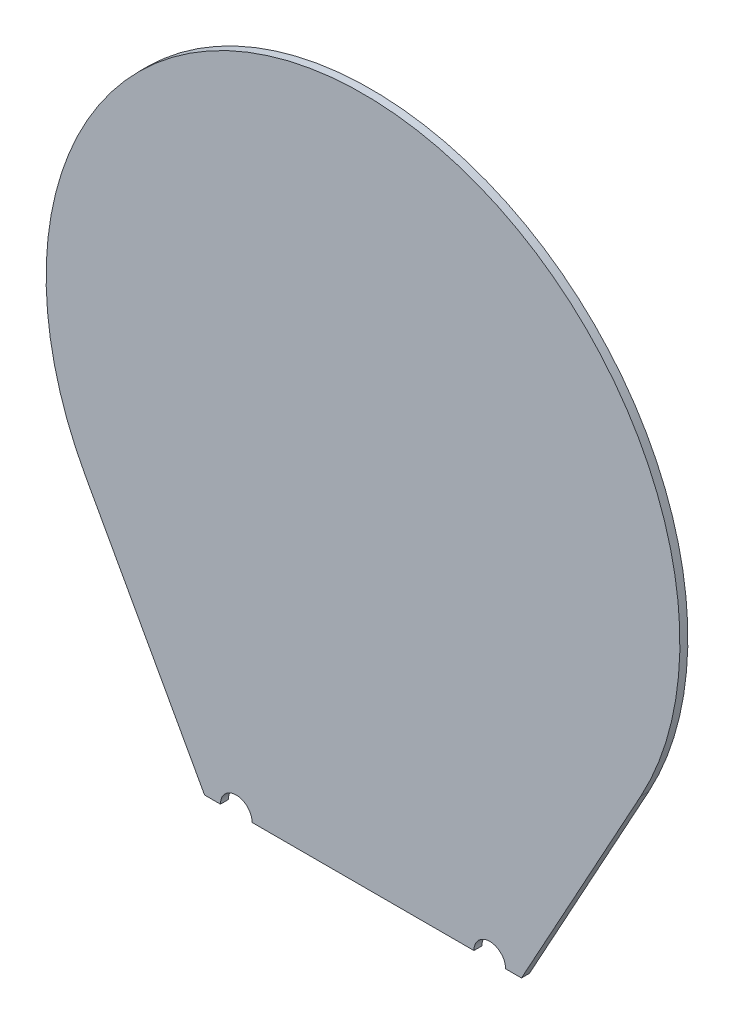
ISO-10303-21;
HEADER;
FILE_DESCRIPTION(('STEP AP214'),'2;1');
FILE_NAME('part.step','',(''),(''),'','','');
FILE_SCHEMA(('AUTOMOTIVE_DESIGN { 1 0 10303 214 1 1 1 1 }'));
ENDSEC;
DATA;
#1=APPLICATION_CONTEXT('core data for automotive mechanical design processes');
#2=APPLICATION_PROTOCOL_DEFINITION('international standard','automotive_design',2000,#1);
#3=PRODUCT_CONTEXT('',#1,'mechanical');
#4=PRODUCT('Part','Part','',(#3));
#5=PRODUCT_RELATED_PRODUCT_CATEGORY('part','',(#4));
#6=PRODUCT_DEFINITION_FORMATION('','',#4);
#7=PRODUCT_DEFINITION_CONTEXT('part definition',#1,'design');
#8=PRODUCT_DEFINITION('design','',#6,#7);
#9=PRODUCT_DEFINITION_SHAPE('','',#8);
#10=(LENGTH_UNIT() NAMED_UNIT(*) SI_UNIT(.MILLI.,.METRE.));
#11=(NAMED_UNIT(*) PLANE_ANGLE_UNIT() SI_UNIT($,.RADIAN.));
#12=(NAMED_UNIT(*) SI_UNIT($,.STERADIAN.) SOLID_ANGLE_UNIT());
#13=UNCERTAINTY_MEASURE_WITH_UNIT(LENGTH_MEASURE(1.E-05),#10,'distance_accuracy_value','');
#14=(GEOMETRIC_REPRESENTATION_CONTEXT(3) GLOBAL_UNCERTAINTY_ASSIGNED_CONTEXT((#13)) GLOBAL_UNIT_ASSIGNED_CONTEXT((#10,
#11,#12)) REPRESENTATION_CONTEXT('',''));
#15=CARTESIAN_POINT('',(0.,0.,0.));
#16=DIRECTION('',(0.,0.,1.));
#17=DIRECTION('',(1.,0.,0.));
#18=AXIS2_PLACEMENT_3D('',#15,#16,#17);
#19=CARTESIAN_POINT('',(0.,-35.,0.75438));
#20=DIRECTION('',(0.,1.,0.));
#21=DIRECTION('',(0.,0.,1.));
#22=AXIS2_PLACEMENT_3D('',#19,#20,#21);
#23=PLANE('',#22);
#24=DIRECTION('',(0.,0.,1.));
#25=VECTOR('',#24,1.);
#26=CARTESIAN_POINT('',(10.5,-35.,-9.24562));
#27=LINE('',#26,#25);
#28=CARTESIAN_POINT('',(10.5,-35.,0.));
#29=VERTEX_POINT('',#28);
#30=CARTESIAN_POINT('',(10.5,-35.,0.75438));
#31=VERTEX_POINT('',#30);
#32=EDGE_CURVE('E59',#29,#31,#27,.T.);
#33=ORIENTED_EDGE('',*,*,#32,.T.);
#34=DIRECTION('',(1.,0.,0.));
#35=VECTOR('',#34,1.);
#36=CARTESIAN_POINT('',(0.,-35.,0.75438));
#37=LINE('',#36,#35);
#38=CARTESIAN_POINT('',(-10.5,-35.,0.75438));
#39=VERTEX_POINT('',#38);
#40=EDGE_CURVE('E120',#39,#31,#37,.T.);
#41=ORIENTED_EDGE('',*,*,#40,.F.);
#42=DIRECTION('',(0.,0.,1.));
#43=VECTOR('',#42,1.);
#44=CARTESIAN_POINT('',(-10.5,-35.,-9.24562));
#45=LINE('',#44,#43);
#46=CARTESIAN_POINT('',(-10.5,-35.,0.));
#47=VERTEX_POINT('',#46);
#48=EDGE_CURVE('E202',#47,#39,#45,.T.);
#49=ORIENTED_EDGE('',*,*,#48,.F.);
#50=DIRECTION('',(1.,0.,0.));
#51=VECTOR('',#50,1.);
#52=CARTESIAN_POINT('',(0.,-35.,0.));
#53=LINE('',#52,#51);
#54=EDGE_CURVE('E122',#47,#29,#53,.T.);
#55=ORIENTED_EDGE('',*,*,#54,.T.);
#56=EDGE_LOOP('',(#33,#41,#49,#55));
#57=FACE_BOUND('',#56,.T.);
#58=ADVANCED_FACE('F44',(#57),#23,.F.);
#59=DIRECTION('',(0.,0.,1.));
#60=VECTOR('',#59,1.);
#61=CARTESIAN_POINT('',(13.5,-35.,-9.24562));
#62=LINE('',#61,#60);
#63=CARTESIAN_POINT('',(13.5,-35.,0.));
#64=VERTEX_POINT('',#63);
#65=CARTESIAN_POINT('',(13.5,-35.,0.75438));
#66=VERTEX_POINT('',#65);
#67=EDGE_CURVE('E110',#64,#66,#62,.T.);
#68=ORIENTED_EDGE('',*,*,#67,.F.);
#69=CARTESIAN_POINT('',(15.,-35.,0.));
#70=VERTEX_POINT('',#69);
#71=EDGE_CURVE('E152',#64,#70,#53,.T.);
#72=ORIENTED_EDGE('',*,*,#71,.T.);
#73=DIRECTION('',(0.,0.,-1.));
#74=VECTOR('',#73,1.);
#75=CARTESIAN_POINT('',(15.,-35.,0.75438));
#76=LINE('',#75,#74);
#77=CARTESIAN_POINT('',(15.,-35.,0.75438));
#78=VERTEX_POINT('',#77);
#79=EDGE_CURVE('E135',#78,#70,#76,.T.);
#80=ORIENTED_EDGE('',*,*,#79,.F.);
#81=EDGE_CURVE('E131',#66,#78,#37,.T.);
#82=ORIENTED_EDGE('',*,*,#81,.F.);
#83=EDGE_LOOP('',(#68,#72,#80,#82));
#84=FACE_BOUND('',#83,.T.);
#85=ADVANCED_FACE('F194',(#84),#23,.F.);
#86=CARTESIAN_POINT('',(-15.,-35.,0.));
#87=VERTEX_POINT('',#86);
#88=CARTESIAN_POINT('',(-13.5,-35.,0.));
#89=VERTEX_POINT('',#88);
#90=EDGE_CURVE('E153',#87,#89,#53,.T.);
#91=ORIENTED_EDGE('',*,*,#90,.T.);
#92=DIRECTION('',(0.,0.,1.));
#93=VECTOR('',#92,1.);
#94=CARTESIAN_POINT('',(-13.5,-35.,-9.24562));
#95=LINE('',#94,#93);
#96=CARTESIAN_POINT('',(-13.5,-35.,0.75438));
#97=VERTEX_POINT('',#96);
#98=EDGE_CURVE('E67',#89,#97,#95,.T.);
#99=ORIENTED_EDGE('',*,*,#98,.T.);
#100=CARTESIAN_POINT('',(-15.,-35.,0.75438));
#101=VERTEX_POINT('',#100);
#102=EDGE_CURVE('E130',#101,#97,#37,.T.);
#103=ORIENTED_EDGE('',*,*,#102,.F.);
#104=DIRECTION('',(0.,0.,-1.));
#105=VECTOR('',#104,1.);
#106=CARTESIAN_POINT('',(-15.,-35.,0.75438));
#107=LINE('',#106,#105);
#108=EDGE_CURVE('E161',#101,#87,#107,.T.);
#109=ORIENTED_EDGE('',*,*,#108,.T.);
#110=EDGE_LOOP('',(#91,#99,#103,#109));
#111=FACE_BOUND('',#110,.T.);
#112=ADVANCED_FACE('F176',(#111),#23,.F.);
#113=CARTESIAN_POINT('',(0.,0.,0.75438));
#114=DIRECTION('',(0.,0.,1.));
#115=DIRECTION('',(1.,0.,0.));
#116=AXIS2_PLACEMENT_3D('',#113,#114,#115);
#117=PLANE('',#116);
#118=ORIENTED_EDGE('',*,*,#40,.T.);
#119=CARTESIAN_POINT('',(12.,-35.,0.75438));
#120=DIRECTION('',(0.,0.,1.));
#121=DIRECTION('',(1.,0.,0.));
#122=AXIS2_PLACEMENT_3D('',#119,#120,#121);
#123=CIRCLE('',#122,1.5);
#124=EDGE_CURVE('E107',#31,#66,#123,.F.);
#125=ORIENTED_EDGE('',*,*,#124,.T.);
#126=ORIENTED_EDGE('',*,*,#81,.T.);
#127=DIRECTION('',(0.481530219319478,0.876429488254552,0.));
#128=VECTOR('',#127,1.);
#129=CARTESIAN_POINT('',(26.2928846476366,-14.4459065795843,0.75438));
#130=LINE('',#129,#128);
#131=CARTESIAN_POINT('',(26.2928846476366,-14.4459065795843,0.75438));
#132=VERTEX_POINT('',#131);
#133=EDGE_CURVE('E157',#78,#132,#130,.T.);
#134=ORIENTED_EDGE('',*,*,#133,.T.);
#135=CARTESIAN_POINT('',(0.,0.,0.75438));
#136=DIRECTION('',(0.,0.,1.));
#137=DIRECTION('',(1.,0.,0.));
#138=AXIS2_PLACEMENT_3D('',#135,#136,#137);
#139=CIRCLE('',#138,30.);
#140=CARTESIAN_POINT('',(-26.2928846476366,-14.4459065795843,0.75438));
#141=VERTEX_POINT('',#140);
#142=EDGE_CURVE('E188',#132,#141,#139,.T.);
#143=ORIENTED_EDGE('',*,*,#142,.T.);
#144=DIRECTION('',(-0.481530219319478,0.876429488254552,0.));
#145=VECTOR('',#144,1.);
#146=CARTESIAN_POINT('',(-26.2928846476366,-14.4459065795843,0.75438));
#147=LINE('',#146,#145);
#148=EDGE_CURVE('E136',#101,#141,#147,.T.);
#149=ORIENTED_EDGE('',*,*,#148,.F.);
#150=ORIENTED_EDGE('',*,*,#102,.T.);
#151=CARTESIAN_POINT('',(-12.,-35.,0.75438));
#152=DIRECTION('',(0.,0.,1.));
#153=DIRECTION('',(1.,0.,0.));
#154=AXIS2_PLACEMENT_3D('',#151,#152,#153);
#155=CIRCLE('',#154,1.5);
#156=EDGE_CURVE('E128',#39,#97,#155,.T.);
#157=ORIENTED_EDGE('',*,*,#156,.F.);
#158=EDGE_LOOP('',(#118,#125,#126,#134,#143,#149,#150,#157));
#159=FACE_BOUND('',#158,.T.);
#160=ADVANCED_FACE('F126',(#159),#117,.T.);
#161=CARTESIAN_POINT('',(0.,0.,0.));
#162=DIRECTION('',(0.,0.,1.));
#163=DIRECTION('',(1.,0.,0.));
#164=AXIS2_PLACEMENT_3D('',#161,#162,#163);
#165=PLANE('',#164);
#166=CARTESIAN_POINT('',(12.,-35.,0.));
#167=DIRECTION('',(0.,0.,1.));
#168=DIRECTION('',(1.,0.,0.));
#169=AXIS2_PLACEMENT_3D('',#166,#167,#168);
#170=CIRCLE('',#169,1.5);
#171=EDGE_CURVE('E11',#29,#64,#170,.F.);
#172=ORIENTED_EDGE('',*,*,#171,.F.);
#173=ORIENTED_EDGE('',*,*,#54,.F.);
#174=CARTESIAN_POINT('',(-12.,-35.,0.));
#175=DIRECTION('',(0.,0.,1.));
#176=DIRECTION('',(1.,0.,0.));
#177=AXIS2_PLACEMENT_3D('',#174,#175,#176);
#178=CIRCLE('',#177,1.5);
#179=EDGE_CURVE('E53',#47,#89,#178,.T.);
#180=ORIENTED_EDGE('',*,*,#179,.T.);
#181=ORIENTED_EDGE('',*,*,#90,.F.);
#182=DIRECTION('',(-0.481530219319478,0.876429488254552,0.));
#183=VECTOR('',#182,1.);
#184=CARTESIAN_POINT('',(-26.2928846476366,-14.4459065795843,0.));
#185=LINE('',#184,#183);
#186=CARTESIAN_POINT('',(-26.2928846476366,-14.4459065795843,0.));
#187=VERTEX_POINT('',#186);
#188=EDGE_CURVE('E148',#87,#187,#185,.T.);
#189=ORIENTED_EDGE('',*,*,#188,.T.);
#190=CARTESIAN_POINT('',(0.,0.,0.));
#191=DIRECTION('',(0.,0.,1.));
#192=DIRECTION('',(1.,0.,0.));
#193=AXIS2_PLACEMENT_3D('',#190,#191,#192);
#194=CIRCLE('',#193,30.);
#195=CARTESIAN_POINT('',(26.2928846476366,-14.4459065795843,0.));
#196=VERTEX_POINT('',#195);
#197=EDGE_CURVE('E144',#196,#187,#194,.T.);
#198=ORIENTED_EDGE('',*,*,#197,.F.);
#199=DIRECTION('',(0.481530219319478,0.876429488254552,0.));
#200=VECTOR('',#199,1.);
#201=CARTESIAN_POINT('',(26.2928846476366,-14.4459065795843,0.));
#202=LINE('',#201,#200);
#203=EDGE_CURVE('E140',#70,#196,#202,.T.);
#204=ORIENTED_EDGE('',*,*,#203,.F.);
#205=ORIENTED_EDGE('',*,*,#71,.F.);
#206=EDGE_LOOP('',(#172,#173,#180,#181,#189,#198,#204,#205));
#207=FACE_BOUND('',#206,.T.);
#208=ADVANCED_FACE('F173',(#207),#165,.F.);
#209=CARTESIAN_POINT('',(26.2928846476366,-14.4459065795843,0.75438));
#210=DIRECTION('',(-0.876429488254551,0.481530219319478,0.));
#211=DIRECTION('',(-0.481530219319478,-0.876429488254552,0.));
#212=AXIS2_PLACEMENT_3D('',#209,#210,#211);
#213=PLANE('',#212);
#214=ORIENTED_EDGE('',*,*,#203,.T.);
#215=DIRECTION('',(0.,0.,-1.));
#216=VECTOR('',#215,1.);
#217=CARTESIAN_POINT('',(26.2928846476366,-14.4459065795843,0.75438));
#218=LINE('',#217,#216);
#219=EDGE_CURVE('E167',#132,#196,#218,.T.);
#220=ORIENTED_EDGE('',*,*,#219,.F.);
#221=ORIENTED_EDGE('',*,*,#133,.F.);
#222=ORIENTED_EDGE('',*,*,#79,.T.);
#223=EDGE_LOOP('',(#214,#220,#221,#222));
#224=FACE_BOUND('',#223,.T.);
#225=ADVANCED_FACE('F46',(#224),#213,.F.);
#226=CARTESIAN_POINT('',(0.,0.,0.75438));
#227=DIRECTION('',(0.,0.,-1.));
#228=DIRECTION('',(-1.,0.,0.));
#229=AXIS2_PLACEMENT_3D('',#226,#227,#228);
#230=CYLINDRICAL_SURFACE('',#229,30.);
#231=ORIENTED_EDGE('',*,*,#197,.T.);
#232=DIRECTION('',(0.,0.,-1.));
#233=VECTOR('',#232,1.);
#234=CARTESIAN_POINT('',(-26.2928846476366,-14.4459065795843,0.75438));
#235=LINE('',#234,#233);
#236=EDGE_CURVE('E164',#141,#187,#235,.T.);
#237=ORIENTED_EDGE('',*,*,#236,.F.);
#238=ORIENTED_EDGE('',*,*,#142,.F.);
#239=ORIENTED_EDGE('',*,*,#219,.T.);
#240=EDGE_LOOP('',(#231,#237,#238,#239));
#241=FACE_BOUND('',#240,.T.);
#242=ADVANCED_FACE('F187',(#241),#230,.T.);
#243=CARTESIAN_POINT('',(-26.2928846476366,-14.4459065795843,0.75438));
#244=DIRECTION('',(-0.876429488254552,-0.481530219319478,0.));
#245=DIRECTION('',(0.481530219319478,-0.876429488254552,0.));
#246=AXIS2_PLACEMENT_3D('',#243,#244,#245);
#247=PLANE('',#246);
#248=ORIENTED_EDGE('',*,*,#188,.F.);
#249=ORIENTED_EDGE('',*,*,#108,.F.);
#250=ORIENTED_EDGE('',*,*,#148,.T.);
#251=ORIENTED_EDGE('',*,*,#236,.T.);
#252=EDGE_LOOP('',(#248,#249,#250,#251));
#253=FACE_BOUND('',#252,.T.);
#254=ADVANCED_FACE('F181',(#253),#247,.T.);
#255=CARTESIAN_POINT('',(-12.,-35.,-9.24562));
#256=DIRECTION('',(0.,0.,1.));
#257=DIRECTION('',(1.,0.,0.));
#258=AXIS2_PLACEMENT_3D('',#255,#256,#257);
#259=CYLINDRICAL_SURFACE('',#258,1.5);
#260=ORIENTED_EDGE('',*,*,#48,.T.);
#261=ORIENTED_EDGE('',*,*,#156,.T.);
#262=ORIENTED_EDGE('',*,*,#98,.F.);
#263=ORIENTED_EDGE('',*,*,#179,.F.);
#264=EDGE_LOOP('',(#260,#261,#262,#263));
#265=FACE_BOUND('',#264,.T.);
#266=ADVANCED_FACE('F210',(#265),#259,.F.);
#267=CARTESIAN_POINT('',(12.,-35.,-9.24562));
#268=DIRECTION('',(0.,0.,1.));
#269=DIRECTION('',(1.,0.,0.));
#270=AXIS2_PLACEMENT_3D('',#267,#268,#269);
#271=CYLINDRICAL_SURFACE('',#270,1.5);
#272=ORIENTED_EDGE('',*,*,#171,.T.);
#273=ORIENTED_EDGE('',*,*,#67,.T.);
#274=ORIENTED_EDGE('',*,*,#124,.F.);
#275=ORIENTED_EDGE('',*,*,#32,.F.);
#276=EDGE_LOOP('',(#272,#273,#274,#275));
#277=FACE_BOUND('',#276,.T.);
#278=ADVANCED_FACE('F108',(#277),#271,.F.);
#279=CLOSED_SHELL('',(#58,#85,#112,#160,#208,#225,#242,#254,#266,#278));
#280=MANIFOLD_SOLID_BREP('B2',#279);
#281=ADVANCED_BREP_SHAPE_REPRESENTATION('',(#18,#280),#14);
#282=SHAPE_DEFINITION_REPRESENTATION(#9,#281);
ENDSEC;
END-ISO-10303-21;
